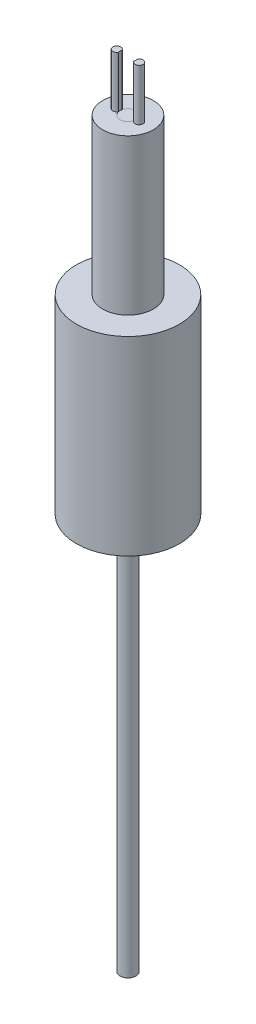
ISO-10303-21;
HEADER;
FILE_DESCRIPTION(('STEP AP214'),'2;1');
FILE_NAME('part.step','',(''),(''),'','','');
FILE_SCHEMA(('AUTOMOTIVE_DESIGN { 1 0 10303 214 1 1 1 1 }'));
ENDSEC;
DATA;
#1=APPLICATION_CONTEXT('core data for automotive mechanical design processes');
#2=APPLICATION_PROTOCOL_DEFINITION('international standard','automotive_design',2000,#1);
#3=PRODUCT_CONTEXT('',#1,'mechanical');
#4=PRODUCT('Part','Part','',(#3));
#5=PRODUCT_RELATED_PRODUCT_CATEGORY('part','',(#4));
#6=PRODUCT_DEFINITION_FORMATION('','',#4);
#7=PRODUCT_DEFINITION_CONTEXT('part definition',#1,'design');
#8=PRODUCT_DEFINITION('design','',#6,#7);
#9=PRODUCT_DEFINITION_SHAPE('','',#8);
#10=(LENGTH_UNIT() NAMED_UNIT(*) SI_UNIT(.MILLI.,.METRE.));
#11=(NAMED_UNIT(*) PLANE_ANGLE_UNIT() SI_UNIT($,.RADIAN.));
#12=(NAMED_UNIT(*) SI_UNIT($,.STERADIAN.) SOLID_ANGLE_UNIT());
#13=UNCERTAINTY_MEASURE_WITH_UNIT(LENGTH_MEASURE(1.E-05),#10,'distance_accuracy_value','');
#14=(GEOMETRIC_REPRESENTATION_CONTEXT(3) GLOBAL_UNCERTAINTY_ASSIGNED_CONTEXT((#13)) GLOBAL_UNIT_ASSIGNED_CONTEXT((#10,
#11,#12)) REPRESENTATION_CONTEXT('',''));
#15=CARTESIAN_POINT('',(0.,0.,0.));
#16=DIRECTION('',(0.,0.,1.));
#17=DIRECTION('',(1.,0.,0.));
#18=AXIS2_PLACEMENT_3D('',#15,#16,#17);
#19=CARTESIAN_POINT('',(0.,43.6,0.));
#20=DIRECTION('',(0.,-1.,0.));
#21=DIRECTION('',(0.,0.,-1.));
#22=AXIS2_PLACEMENT_3D('',#19,#20,#21);
#23=CYLINDRICAL_SURFACE('',#22,1.);
#24=CARTESIAN_POINT('',(0.,43.6,0.));
#25=DIRECTION('',(0.,1.,0.));
#26=DIRECTION('',(0.,0.,1.));
#27=AXIS2_PLACEMENT_3D('',#24,#25,#26);
#28=CIRCLE('',#27,1.);
#29=CARTESIAN_POINT('',(0.,43.6,1.));
#30=VERTEX_POINT('',#29);
#31=EDGE_CURVE('E11',#30,#30,#28,.T.);
#32=ORIENTED_EDGE('',*,*,#31,.F.);
#33=EDGE_LOOP('',(#32));
#34=FACE_BOUND('',#33,.T.);
#35=CARTESIAN_POINT('',(0.,-50.,0.));
#36=DIRECTION('',(0.,1.,0.));
#37=DIRECTION('',(0.,0.,1.));
#38=AXIS2_PLACEMENT_3D('',#35,#36,#37);
#39=CIRCLE('',#38,1.);
#40=CARTESIAN_POINT('',(0.,-50.,1.));
#41=VERTEX_POINT('',#40);
#42=EDGE_CURVE('E57',#41,#41,#39,.T.);
#43=ORIENTED_EDGE('',*,*,#42,.T.);
#44=EDGE_LOOP('',(#43));
#45=FACE_BOUND('',#44,.T.);
#46=ADVANCED_FACE('F51',(#34,#45),#23,.T.);
#47=CARTESIAN_POINT('',(0.,43.6,0.));
#48=DIRECTION('',(0.,1.,0.));
#49=DIRECTION('',(0.,0.,1.));
#50=AXIS2_PLACEMENT_3D('',#47,#48,#49);
#51=PLANE('',#50);
#52=ORIENTED_EDGE('',*,*,#31,.T.);
#53=EDGE_LOOP('',(#52));
#54=FACE_BOUND('',#53,.T.);
#55=ADVANCED_FACE('F66',(#54),#51,.T.);
#56=CARTESIAN_POINT('',(0.,-50.,0.));
#57=DIRECTION('',(0.,1.,0.));
#58=DIRECTION('',(0.,0.,1.));
#59=AXIS2_PLACEMENT_3D('',#56,#57,#58);
#60=PLANE('',#59);
#61=ORIENTED_EDGE('',*,*,#42,.F.);
#62=EDGE_LOOP('',(#61));
#63=FACE_BOUND('',#62,.T.);
#64=ADVANCED_FACE('F64',(#63),#60,.F.);
#65=CLOSED_SHELL('',(#46,#55,#64));
#66=MANIFOLD_SOLID_BREP('B2',#65);
#67=CARTESIAN_POINT('',(0.,50.1,0.));
#68=DIRECTION('',(0.,-1.,0.));
#69=DIRECTION('',(0.,0.,-1.));
#70=AXIS2_PLACEMENT_3D('',#67,#68,#69);
#71=CYLINDRICAL_SURFACE('',#70,1.);
#72=CARTESIAN_POINT('',(0.,0.,0.));
#73=DIRECTION('',(0.,1.,0.));
#74=DIRECTION('',(0.,0.,1.));
#75=AXIS2_PLACEMENT_3D('',#72,#73,#74);
#76=CIRCLE('',#75,1.);
#77=CARTESIAN_POINT('',(0.,0.,1.));
#78=VERTEX_POINT('',#77);
#79=EDGE_CURVE('E182',#78,#78,#76,.T.);
#80=ORIENTED_EDGE('',*,*,#79,.F.);
#81=EDGE_LOOP('',(#80));
#82=FACE_BOUND('',#81,.T.);
#83=DIRECTION('',(0.,-1.,0.));
#84=VECTOR('',#83,1.);
#85=CARTESIAN_POINT('',(-0.969692309701334,50.1,0.244329336155307));
#86=LINE('',#85,#84);
#87=CARTESIAN_POINT('',(-0.969692309701334,50.1,0.244329336155307));
#88=VERTEX_POINT('',#87);
#89=CARTESIAN_POINT('',(-0.969692309701334,43.6,0.244329336155307));
#90=VERTEX_POINT('',#89);
#91=EDGE_CURVE('E157',#88,#90,#86,.T.);
#92=ORIENTED_EDGE('',*,*,#91,.T.);
#93=CARTESIAN_POINT('',(0.,43.6,0.));
#94=DIRECTION('',(0.,1.,0.));
#95=DIRECTION('',(0.,0.,1.));
#96=AXIS2_PLACEMENT_3D('',#93,#94,#95);
#97=CIRCLE('',#96,1.);
#98=CARTESIAN_POINT('',(0.969692309701334,43.6,0.244329336155307));
#99=VERTEX_POINT('',#98);
#100=EDGE_CURVE('E175',#90,#99,#97,.T.);
#101=ORIENTED_EDGE('',*,*,#100,.T.);
#102=DIRECTION('',(0.,-1.,0.));
#103=VECTOR('',#102,1.);
#104=CARTESIAN_POINT('',(0.969692309701334,50.1,0.244329336155307));
#105=LINE('',#104,#103);
#106=CARTESIAN_POINT('',(0.969692309701334,50.1,0.244329336155307));
#107=VERTEX_POINT('',#106);
#108=EDGE_CURVE('E49',#107,#99,#105,.T.);
#109=ORIENTED_EDGE('',*,*,#108,.F.);
#110=CARTESIAN_POINT('',(0.,50.1,0.));
#111=DIRECTION('',(0.,1.,0.));
#112=DIRECTION('',(0.,0.,1.));
#113=AXIS2_PLACEMENT_3D('',#110,#111,#112);
#114=CIRCLE('',#113,1.);
#115=CARTESIAN_POINT('',(0.969692309701334,50.1,-0.244329336155307));
#116=VERTEX_POINT('',#115);
#117=EDGE_CURVE('E183',#107,#116,#114,.T.);
#118=ORIENTED_EDGE('',*,*,#117,.T.);
#119=DIRECTION('',(0.,-1.,0.));
#120=VECTOR('',#119,1.);
#121=CARTESIAN_POINT('',(0.969692309701334,50.1,-0.244329336155307));
#122=LINE('',#121,#120);
#123=CARTESIAN_POINT('',(0.969692309701334,43.6,-0.244329336155307));
#124=VERTEX_POINT('',#123);
#125=EDGE_CURVE('E117',#116,#124,#122,.T.);
#126=ORIENTED_EDGE('',*,*,#125,.T.);
#127=CARTESIAN_POINT('',(-0.969692309701334,43.6,-0.244329336155307));
#128=VERTEX_POINT('',#127);
#129=EDGE_CURVE('E153',#124,#128,#97,.T.);
#130=ORIENTED_EDGE('',*,*,#129,.T.);
#131=DIRECTION('',(0.,-1.,0.));
#132=VECTOR('',#131,1.);
#133=CARTESIAN_POINT('',(-0.969692309701334,50.1,-0.244329336155307));
#134=LINE('',#133,#132);
#135=CARTESIAN_POINT('',(-0.969692309701334,50.1,-0.244329336155307));
#136=VERTEX_POINT('',#135);
#137=EDGE_CURVE('E147',#136,#128,#134,.T.);
#138=ORIENTED_EDGE('',*,*,#137,.F.);
#139=CARTESIAN_POINT('',(0.,50.1,0.));
#140=DIRECTION('',(0.,1.,0.));
#141=DIRECTION('',(0.,0.,1.));
#142=AXIS2_PLACEMENT_3D('',#139,#140,#141);
#143=CIRCLE('',#142,1.);
#144=EDGE_CURVE('E151',#136,#88,#143,.T.);
#145=ORIENTED_EDGE('',*,*,#144,.T.);
#146=EDGE_LOOP('',(#92,#101,#109,#118,#126,#130,#138,#145));
#147=FACE_BOUND('',#146,.T.);
#148=ADVANCED_FACE('F110',(#82,#147),#71,.F.);
#149=CARTESIAN_POINT('',(1.40592983157893,50.1,0.));
#150=DIRECTION('',(0.,-1.,0.));
#151=DIRECTION('',(0.,0.,-1.));
#152=AXIS2_PLACEMENT_3D('',#149,#150,#151);
#153=CYLINDRICAL_SURFACE('',#152,0.5);
#154=ORIENTED_EDGE('',*,*,#108,.T.);
#155=CARTESIAN_POINT('',(1.40592983157893,43.6,0.));
#156=DIRECTION('',(0.,1.,0.));
#157=DIRECTION('',(0.,0.,1.));
#158=AXIS2_PLACEMENT_3D('',#155,#156,#157);
#159=CIRCLE('',#158,0.5);
#160=EDGE_CURVE('E126',#99,#124,#159,.T.);
#161=ORIENTED_EDGE('',*,*,#160,.T.);
#162=ORIENTED_EDGE('',*,*,#125,.F.);
#163=CARTESIAN_POINT('',(1.40592983157893,50.1,0.));
#164=DIRECTION('',(0.,1.,0.));
#165=DIRECTION('',(0.,0.,1.));
#166=AXIS2_PLACEMENT_3D('',#163,#164,#165);
#167=CIRCLE('',#166,0.5);
#168=EDGE_CURVE('E186',#107,#116,#167,.T.);
#169=ORIENTED_EDGE('',*,*,#168,.F.);
#170=EDGE_LOOP('',(#154,#161,#162,#169));
#171=FACE_BOUND('',#170,.T.);
#172=ADVANCED_FACE('F194',(#171),#153,.T.);
#173=CARTESIAN_POINT('',(0.,50.1,0.));
#174=DIRECTION('',(0.,1.,0.));
#175=DIRECTION('',(0.,0.,1.));
#176=AXIS2_PLACEMENT_3D('',#173,#174,#175);
#177=PLANE('',#176);
#178=ORIENTED_EDGE('',*,*,#117,.F.);
#179=ORIENTED_EDGE('',*,*,#168,.T.);
#180=EDGE_LOOP('',(#178,#179));
#181=FACE_BOUND('',#180,.T.);
#182=ADVANCED_FACE('F196',(#181),#177,.T.);
#183=CARTESIAN_POINT('',(0.,0.,0.));
#184=DIRECTION('',(0.,1.,0.));
#185=DIRECTION('',(0.,0.,1.));
#186=AXIS2_PLACEMENT_3D('',#183,#184,#185);
#187=PLANE('',#186);
#188=ORIENTED_EDGE('',*,*,#79,.T.);
#189=EDGE_LOOP('',(#188));
#190=FACE_BOUND('',#189,.T.);
#191=CARTESIAN_POINT('',(0.,0.,0.));
#192=DIRECTION('',(0.,1.,0.));
#193=DIRECTION('',(0.,0.,1.));
#194=AXIS2_PLACEMENT_3D('',#191,#192,#193);
#195=CIRCLE('',#194,6.5);
#196=CARTESIAN_POINT('',(0.,0.,6.5));
#197=VERTEX_POINT('',#196);
#198=EDGE_CURVE('E171',#197,#197,#195,.T.);
#199=ORIENTED_EDGE('',*,*,#198,.F.);
#200=EDGE_LOOP('',(#199));
#201=FACE_BOUND('',#200,.T.);
#202=ADVANCED_FACE('F198',(#190,#201),#187,.F.);
#203=CARTESIAN_POINT('',(0.,43.6,0.));
#204=DIRECTION('',(0.,-1.,0.));
#205=DIRECTION('',(0.,0.,-1.));
#206=AXIS2_PLACEMENT_3D('',#203,#204,#205);
#207=CYLINDRICAL_SURFACE('',#206,3.2);
#208=CARTESIAN_POINT('',(0.,24.,0.));
#209=DIRECTION('',(0.,1.,0.));
#210=DIRECTION('',(0.,0.,1.));
#211=AXIS2_PLACEMENT_3D('',#208,#209,#210);
#212=CIRCLE('',#211,3.2);
#213=CARTESIAN_POINT('',(0.,24.,3.2));
#214=VERTEX_POINT('',#213);
#215=EDGE_CURVE('E168',#214,#214,#212,.T.);
#216=ORIENTED_EDGE('',*,*,#215,.T.);
#217=EDGE_LOOP('',(#216));
#218=FACE_BOUND('',#217,.T.);
#219=CARTESIAN_POINT('',(0.,43.6,0.));
#220=DIRECTION('',(0.,1.,0.));
#221=DIRECTION('',(0.,0.,1.));
#222=AXIS2_PLACEMENT_3D('',#219,#220,#221);
#223=CIRCLE('',#222,3.2);
#224=CARTESIAN_POINT('',(0.,43.6,3.2));
#225=VERTEX_POINT('',#224);
#226=EDGE_CURVE('E179',#225,#225,#223,.T.);
#227=ORIENTED_EDGE('',*,*,#226,.F.);
#228=EDGE_LOOP('',(#227));
#229=FACE_BOUND('',#228,.T.);
#230=ADVANCED_FACE('F204',(#218,#229),#207,.T.);
#231=CARTESIAN_POINT('',(0.,43.6,0.));
#232=DIRECTION('',(0.,1.,0.));
#233=DIRECTION('',(0.,0.,1.));
#234=AXIS2_PLACEMENT_3D('',#231,#232,#233);
#235=PLANE('',#234);
#236=ORIENTED_EDGE('',*,*,#129,.F.);
#237=ORIENTED_EDGE('',*,*,#160,.F.);
#238=ORIENTED_EDGE('',*,*,#100,.F.);
#239=CARTESIAN_POINT('',(-1.40592983157893,43.6,0.));
#240=DIRECTION('',(0.,1.,0.));
#241=DIRECTION('',(0.,0.,1.));
#242=AXIS2_PLACEMENT_3D('',#239,#240,#241);
#243=CIRCLE('',#242,0.5);
#244=EDGE_CURVE('E177',#128,#90,#243,.T.);
#245=ORIENTED_EDGE('',*,*,#244,.F.);
#246=EDGE_LOOP('',(#236,#237,#238,#245));
#247=FACE_BOUND('',#246,.T.);
#248=ORIENTED_EDGE('',*,*,#226,.T.);
#249=EDGE_LOOP('',(#248));
#250=FACE_BOUND('',#249,.T.);
#251=ADVANCED_FACE('F191',(#247,#250),#235,.T.);
#252=CARTESIAN_POINT('',(-1.40592983157893,50.1,0.));
#253=DIRECTION('',(0.,-1.,0.));
#254=DIRECTION('',(0.,0.,-1.));
#255=AXIS2_PLACEMENT_3D('',#252,#253,#254);
#256=CYLINDRICAL_SURFACE('',#255,0.5);
#257=ORIENTED_EDGE('',*,*,#244,.T.);
#258=ORIENTED_EDGE('',*,*,#91,.F.);
#259=CARTESIAN_POINT('',(-1.40592983157893,50.1,0.));
#260=DIRECTION('',(0.,1.,0.));
#261=DIRECTION('',(0.,0.,1.));
#262=AXIS2_PLACEMENT_3D('',#259,#260,#261);
#263=CIRCLE('',#262,0.5);
#264=EDGE_CURVE('E160',#136,#88,#263,.T.);
#265=ORIENTED_EDGE('',*,*,#264,.F.);
#266=ORIENTED_EDGE('',*,*,#137,.T.);
#267=EDGE_LOOP('',(#257,#258,#265,#266));
#268=FACE_BOUND('',#267,.T.);
#269=ADVANCED_FACE('F161',(#268),#256,.T.);
#270=CARTESIAN_POINT('',(0.,50.1,0.));
#271=DIRECTION('',(0.,1.,0.));
#272=DIRECTION('',(0.,0.,1.));
#273=AXIS2_PLACEMENT_3D('',#270,#271,#272);
#274=PLANE('',#273);
#275=ORIENTED_EDGE('',*,*,#144,.F.);
#276=ORIENTED_EDGE('',*,*,#264,.T.);
#277=EDGE_LOOP('',(#275,#276));
#278=FACE_BOUND('',#277,.T.);
#279=ADVANCED_FACE('F164',(#278),#274,.T.);
#280=CARTESIAN_POINT('',(0.,24.,0.));
#281=DIRECTION('',(0.,-1.,0.));
#282=DIRECTION('',(0.,0.,-1.));
#283=AXIS2_PLACEMENT_3D('',#280,#281,#282);
#284=CYLINDRICAL_SURFACE('',#283,6.5);
#285=CARTESIAN_POINT('',(0.,24.,0.));
#286=DIRECTION('',(0.,1.,0.));
#287=DIRECTION('',(0.,0.,1.));
#288=AXIS2_PLACEMENT_3D('',#285,#286,#287);
#289=CIRCLE('',#288,6.5);
#290=CARTESIAN_POINT('',(0.,24.,6.5));
#291=VERTEX_POINT('',#290);
#292=EDGE_CURVE('E165',#291,#291,#289,.T.);
#293=ORIENTED_EDGE('',*,*,#292,.F.);
#294=EDGE_LOOP('',(#293));
#295=FACE_BOUND('',#294,.T.);
#296=ORIENTED_EDGE('',*,*,#198,.T.);
#297=EDGE_LOOP('',(#296));
#298=FACE_BOUND('',#297,.T.);
#299=ADVANCED_FACE('F226',(#295,#298),#284,.T.);
#300=CARTESIAN_POINT('',(0.,24.,0.));
#301=DIRECTION('',(0.,1.,0.));
#302=DIRECTION('',(0.,0.,1.));
#303=AXIS2_PLACEMENT_3D('',#300,#301,#302);
#304=PLANE('',#303);
#305=ORIENTED_EDGE('',*,*,#215,.F.);
#306=EDGE_LOOP('',(#305));
#307=FACE_BOUND('',#306,.T.);
#308=ORIENTED_EDGE('',*,*,#292,.T.);
#309=EDGE_LOOP('',(#308));
#310=FACE_BOUND('',#309,.T.);
#311=ADVANCED_FACE('F223',(#307,#310),#304,.T.);
#312=CLOSED_SHELL('',(#148,#172,#182,#202,#230,#251,#269,#279,#299,#311));
#313=MANIFOLD_SOLID_BREP('B6',#312);
#314=ADVANCED_BREP_SHAPE_REPRESENTATION('',(#18,#66,#313),#14);
#315=SHAPE_DEFINITION_REPRESENTATION(#9,#314);
ENDSEC;
END-ISO-10303-21;
